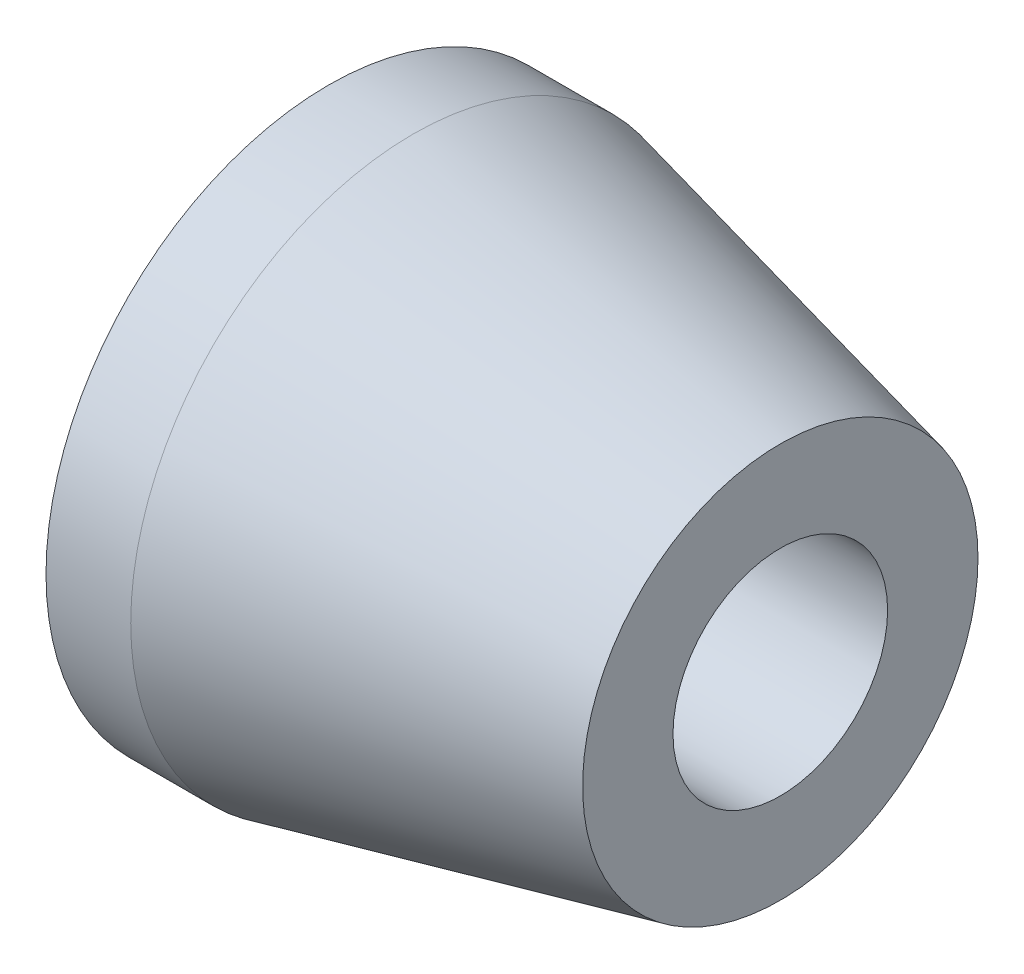
ISO-10303-21;
HEADER;
FILE_DESCRIPTION(('STEP AP214'),'2;1');
FILE_NAME('part.step','',(''),(''),'','','');
FILE_SCHEMA(('AUTOMOTIVE_DESIGN { 1 0 10303 214 1 1 1 1 }'));
ENDSEC;
DATA;
#1=APPLICATION_CONTEXT('core data for automotive mechanical design processes');
#2=APPLICATION_PROTOCOL_DEFINITION('international standard','automotive_design',2000,#1);
#3=PRODUCT_CONTEXT('',#1,'mechanical');
#4=PRODUCT('Part','Part','',(#3));
#5=PRODUCT_RELATED_PRODUCT_CATEGORY('part','',(#4));
#6=PRODUCT_DEFINITION_FORMATION('','',#4);
#7=PRODUCT_DEFINITION_CONTEXT('part definition',#1,'design');
#8=PRODUCT_DEFINITION('design','',#6,#7);
#9=PRODUCT_DEFINITION_SHAPE('','',#8);
#10=(LENGTH_UNIT() NAMED_UNIT(*) SI_UNIT(.MILLI.,.METRE.));
#11=(NAMED_UNIT(*) PLANE_ANGLE_UNIT() SI_UNIT($,.RADIAN.));
#12=(NAMED_UNIT(*) SI_UNIT($,.STERADIAN.) SOLID_ANGLE_UNIT());
#13=UNCERTAINTY_MEASURE_WITH_UNIT(LENGTH_MEASURE(1.E-05),#10,'distance_accuracy_value','');
#14=(GEOMETRIC_REPRESENTATION_CONTEXT(3) GLOBAL_UNCERTAINTY_ASSIGNED_CONTEXT((#13)) GLOBAL_UNIT_ASSIGNED_CONTEXT((#10,
#11,#12)) REPRESENTATION_CONTEXT('',''));
#15=CARTESIAN_POINT('',(0.,0.,0.));
#16=DIRECTION('',(0.,0.,1.));
#17=DIRECTION('',(1.,0.,0.));
#18=AXIS2_PLACEMENT_3D('',#15,#16,#17);
#19=CARTESIAN_POINT('',(0.,7.,0.));
#20=DIRECTION('',(1.,0.,0.));
#21=DIRECTION('',(0.,0.,-1.));
#22=AXIS2_PLACEMENT_3D('',#19,#20,#21);
#23=PLANE('',#22);
#24=CARTESIAN_POINT('',(0.,0.,0.));
#25=DIRECTION('',(1.,0.,0.));
#26=DIRECTION('',(0.,0.,-1.));
#27=AXIS2_PLACEMENT_3D('',#24,#25,#26);
#28=CIRCLE('',#27,7.);
#29=CARTESIAN_POINT('',(0.,0.,-7.));
#30=VERTEX_POINT('',#29);
#31=EDGE_CURVE('E70',#30,#30,#28,.T.);
#32=ORIENTED_EDGE('',*,*,#31,.T.);
#33=EDGE_LOOP('',(#32));
#34=FACE_BOUND('',#33,.T.);
#35=CARTESIAN_POINT('',(0.,0.,0.));
#36=DIRECTION('',(1.,0.,0.));
#37=DIRECTION('',(0.,0.,-1.));
#38=AXIS2_PLACEMENT_3D('',#35,#36,#37);
#39=CIRCLE('',#38,3.8);
#40=CARTESIAN_POINT('',(0.,0.,-3.8));
#41=VERTEX_POINT('',#40);
#42=EDGE_CURVE('E10',#41,#41,#39,.T.);
#43=ORIENTED_EDGE('',*,*,#42,.F.);
#44=EDGE_LOOP('',(#43));
#45=FACE_BOUND('',#44,.T.);
#46=ADVANCED_FACE('F39',(#34,#45),#23,.T.);
#47=CARTESIAN_POINT('',(0.,0.,0.));
#48=DIRECTION('',(1.,0.,0.));
#49=DIRECTION('',(0.,0.,-1.));
#50=AXIS2_PLACEMENT_3D('',#47,#48,#49);
#51=CYLINDRICAL_SURFACE('',#50,3.8);
#52=ORIENTED_EDGE('',*,*,#42,.T.);
#53=EDGE_LOOP('',(#52));
#54=FACE_BOUND('',#53,.T.);
#55=CARTESIAN_POINT('',(-14.,0.,0.));
#56=DIRECTION('',(1.,0.,0.));
#57=DIRECTION('',(0.,0.,-1.));
#58=AXIS2_PLACEMENT_3D('',#55,#56,#57);
#59=CIRCLE('',#58,3.8);
#60=CARTESIAN_POINT('',(-14.,0.,-3.8));
#61=VERTEX_POINT('',#60);
#62=EDGE_CURVE('E46',#61,#61,#59,.T.);
#63=ORIENTED_EDGE('',*,*,#62,.F.);
#64=EDGE_LOOP('',(#63));
#65=FACE_BOUND('',#64,.T.);
#66=ADVANCED_FACE('F89',(#54,#65),#51,.F.);
#67=CARTESIAN_POINT('',(-14.,3.8,0.));
#68=DIRECTION('',(-1.,0.,0.));
#69=DIRECTION('',(0.,0.,1.));
#70=AXIS2_PLACEMENT_3D('',#67,#68,#69);
#71=PLANE('',#70);
#72=ORIENTED_EDGE('',*,*,#62,.T.);
#73=EDGE_LOOP('',(#72));
#74=FACE_BOUND('',#73,.T.);
#75=CARTESIAN_POINT('',(-14.,0.,0.));
#76=DIRECTION('',(1.,0.,0.));
#77=DIRECTION('',(0.,0.,-1.));
#78=AXIS2_PLACEMENT_3D('',#75,#76,#77);
#79=CIRCLE('',#78,5.5);
#80=CARTESIAN_POINT('',(-14.,0.,-5.5));
#81=VERTEX_POINT('',#80);
#82=EDGE_CURVE('E51',#81,#81,#79,.T.);
#83=ORIENTED_EDGE('',*,*,#82,.F.);
#84=EDGE_LOOP('',(#83));
#85=FACE_BOUND('',#84,.T.);
#86=ADVANCED_FACE('F93',(#74,#85),#71,.T.);
#87=CARTESIAN_POINT('',(0.,0.,0.));
#88=DIRECTION('',(1.,0.,0.));
#89=DIRECTION('',(0.,0.,-1.));
#90=AXIS2_PLACEMENT_3D('',#87,#88,#89);
#91=CYLINDRICAL_SURFACE('',#90,5.5);
#92=ORIENTED_EDGE('',*,*,#82,.T.);
#93=EDGE_LOOP('',(#92));
#94=FACE_BOUND('',#93,.T.);
#95=CARTESIAN_POINT('',(-16.,0.,0.));
#96=DIRECTION('',(1.,0.,0.));
#97=DIRECTION('',(0.,0.,-1.));
#98=AXIS2_PLACEMENT_3D('',#95,#96,#97);
#99=CIRCLE('',#98,5.5);
#100=CARTESIAN_POINT('',(-16.,0.,-5.5));
#101=VERTEX_POINT('',#100);
#102=EDGE_CURVE('E56',#101,#101,#99,.T.);
#103=ORIENTED_EDGE('',*,*,#102,.F.);
#104=EDGE_LOOP('',(#103));
#105=FACE_BOUND('',#104,.T.);
#106=ADVANCED_FACE('F97',(#94,#105),#91,.F.);
#107=CARTESIAN_POINT('',(-16.,5.5,0.));
#108=DIRECTION('',(-1.,0.,0.));
#109=DIRECTION('',(0.,0.,1.));
#110=AXIS2_PLACEMENT_3D('',#107,#108,#109);
#111=PLANE('',#110);
#112=ORIENTED_EDGE('',*,*,#102,.T.);
#113=EDGE_LOOP('',(#112));
#114=FACE_BOUND('',#113,.T.);
#115=CARTESIAN_POINT('',(-16.,0.,0.));
#116=DIRECTION('',(1.,0.,0.));
#117=DIRECTION('',(0.,0.,-1.));
#118=AXIS2_PLACEMENT_3D('',#115,#116,#117);
#119=CIRCLE('',#118,10.);
#120=CARTESIAN_POINT('',(-16.,0.,-10.));
#121=VERTEX_POINT('',#120);
#122=EDGE_CURVE('E62',#121,#121,#119,.T.);
#123=ORIENTED_EDGE('',*,*,#122,.F.);
#124=EDGE_LOOP('',(#123));
#125=FACE_BOUND('',#124,.T.);
#126=ADVANCED_FACE('F85',(#114,#125),#111,.T.);
#127=CARTESIAN_POINT('',(0.,0.,0.));
#128=DIRECTION('',(1.,0.,0.));
#129=DIRECTION('',(0.,0.,-1.));
#130=AXIS2_PLACEMENT_3D('',#127,#128,#129);
#131=CYLINDRICAL_SURFACE('',#130,10.);
#132=ORIENTED_EDGE('',*,*,#122,.T.);
#133=EDGE_LOOP('',(#132));
#134=FACE_BOUND('',#133,.T.);
#135=CARTESIAN_POINT('',(-13.,0.,0.));
#136=DIRECTION('',(1.,0.,0.));
#137=DIRECTION('',(0.,0.,-1.));
#138=AXIS2_PLACEMENT_3D('',#135,#136,#137);
#139=CIRCLE('',#138,10.);
#140=CARTESIAN_POINT('',(-13.,0.,-10.));
#141=VERTEX_POINT('',#140);
#142=EDGE_CURVE('E66',#141,#141,#139,.T.);
#143=ORIENTED_EDGE('',*,*,#142,.F.);
#144=EDGE_LOOP('',(#143));
#145=FACE_BOUND('',#144,.T.);
#146=ADVANCED_FACE('F79',(#134,#145),#131,.T.);
#147=CARTESIAN_POINT('',(0.,0.,0.));
#148=DIRECTION('',(-1.,0.,0.));
#149=DIRECTION('',(0.,0.,1.));
#150=AXIS2_PLACEMENT_3D('',#147,#148,#149);
#151=CONICAL_SURFACE('',#150,7.,0.226798848053886);
#152=ORIENTED_EDGE('',*,*,#142,.T.);
#153=EDGE_LOOP('',(#152));
#154=FACE_BOUND('',#153,.T.);
#155=ORIENTED_EDGE('',*,*,#31,.F.);
#156=EDGE_LOOP('',(#155));
#157=FACE_BOUND('',#156,.T.);
#158=ADVANCED_FACE('F77',(#154,#157),#151,.T.);
#159=CLOSED_SHELL('',(#46,#66,#86,#106,#126,#146,#158));
#160=MANIFOLD_SOLID_BREP('B2',#159);
#161=ADVANCED_BREP_SHAPE_REPRESENTATION('',(#18,#160),#14);
#162=SHAPE_DEFINITION_REPRESENTATION(#9,#161);
ENDSEC;
END-ISO-10303-21;
